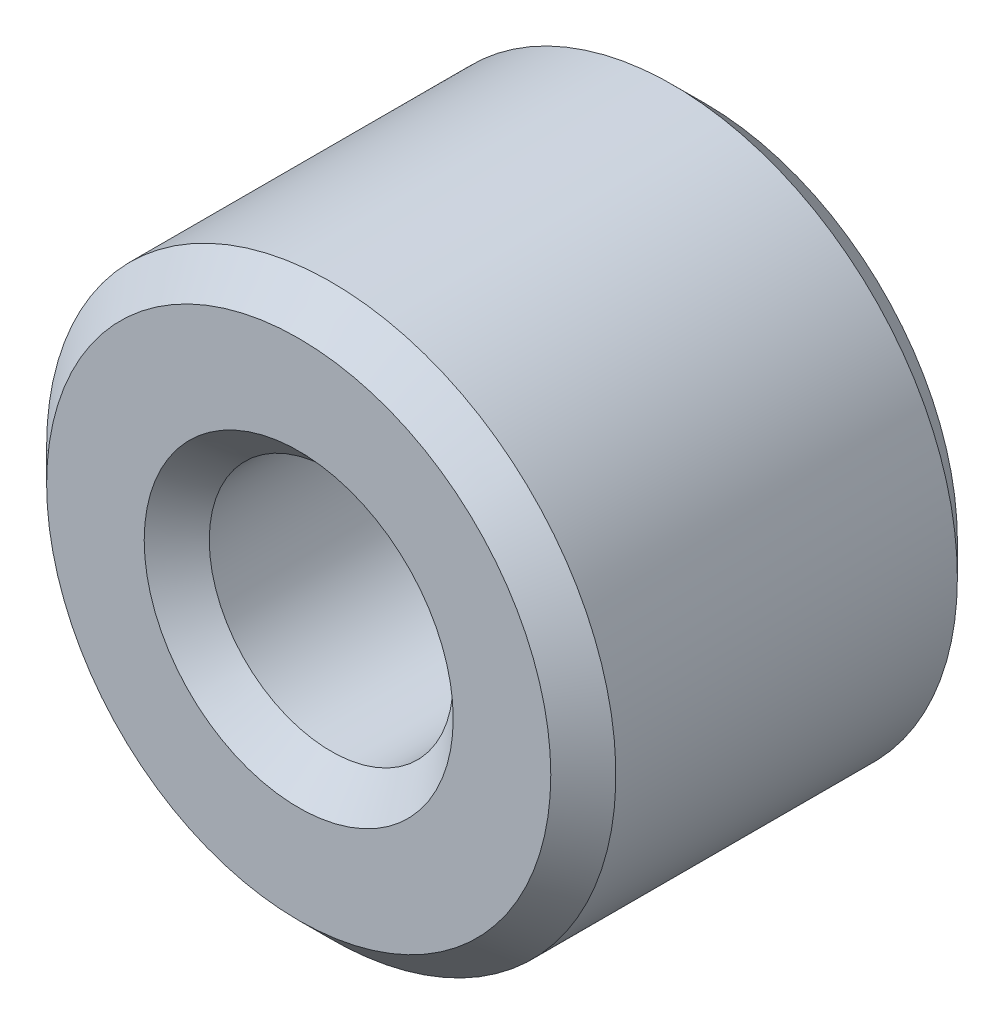
ISO-10303-21;
HEADER;
FILE_DESCRIPTION(('STEP AP214'),'2;1');
FILE_NAME('part.step','',(''),(''),'','','');
FILE_SCHEMA(('AUTOMOTIVE_DESIGN { 1 0 10303 214 1 1 1 1 }'));
ENDSEC;
DATA;
#1=APPLICATION_CONTEXT('core data for automotive mechanical design processes');
#2=APPLICATION_PROTOCOL_DEFINITION('international standard','automotive_design',2000,#1);
#3=PRODUCT_CONTEXT('',#1,'mechanical');
#4=PRODUCT('Part','Part','',(#3));
#5=PRODUCT_RELATED_PRODUCT_CATEGORY('part','',(#4));
#6=PRODUCT_DEFINITION_FORMATION('','',#4);
#7=PRODUCT_DEFINITION_CONTEXT('part definition',#1,'design');
#8=PRODUCT_DEFINITION('design','',#6,#7);
#9=PRODUCT_DEFINITION_SHAPE('','',#8);
#10=(LENGTH_UNIT() NAMED_UNIT(*) SI_UNIT(.MILLI.,.METRE.));
#11=(NAMED_UNIT(*) PLANE_ANGLE_UNIT() SI_UNIT($,.RADIAN.));
#12=(NAMED_UNIT(*) SI_UNIT($,.STERADIAN.) SOLID_ANGLE_UNIT());
#13=UNCERTAINTY_MEASURE_WITH_UNIT(LENGTH_MEASURE(1.E-05),#10,'distance_accuracy_value','');
#14=(GEOMETRIC_REPRESENTATION_CONTEXT(3) GLOBAL_UNCERTAINTY_ASSIGNED_CONTEXT((#13)) GLOBAL_UNIT_ASSIGNED_CONTEXT((#10,
#11,#12)) REPRESENTATION_CONTEXT('',''));
#15=CARTESIAN_POINT('',(0.,0.,0.));
#16=DIRECTION('',(0.,0.,1.));
#17=DIRECTION('',(1.,0.,0.));
#18=AXIS2_PLACEMENT_3D('',#15,#16,#17);
#19=CARTESIAN_POINT('',(0.,0.,5.));
#20=DIRECTION('',(0.,0.,1.));
#21=DIRECTION('',(1.,0.,0.));
#22=AXIS2_PLACEMENT_3D('',#19,#20,#21);
#23=PLANE('',#22);
#24=CARTESIAN_POINT('',(0.,0.,5.));
#25=DIRECTION('',(0.,0.,1.));
#26=DIRECTION('',(1.,0.,0.));
#27=AXIS2_PLACEMENT_3D('',#24,#25,#26);
#28=CIRCLE('',#27,1.9);
#29=CARTESIAN_POINT('',(1.9,0.,5.));
#30=VERTEX_POINT('',#29);
#31=EDGE_CURVE('E10',#30,#30,#28,.F.);
#32=ORIENTED_EDGE('',*,*,#31,.T.);
#33=EDGE_LOOP('',(#32));
#34=FACE_BOUND('',#33,.T.);
#35=CARTESIAN_POINT('',(0.,0.,5.));
#36=DIRECTION('',(0.,0.,1.));
#37=DIRECTION('',(1.,0.,0.));
#38=AXIS2_PLACEMENT_3D('',#35,#36,#37);
#39=CIRCLE('',#38,3.1);
#40=CARTESIAN_POINT('',(-3.1,0.,5.));
#41=VERTEX_POINT('',#40);
#42=EDGE_CURVE('E43',#41,#41,#39,.T.);
#43=ORIENTED_EDGE('',*,*,#42,.T.);
#44=EDGE_LOOP('',(#43));
#45=FACE_BOUND('',#44,.T.);
#46=ADVANCED_FACE('F35',(#34,#45),#23,.T.);
#47=CARTESIAN_POINT('',(0.,0.,0.));
#48=DIRECTION('',(0.,0.,1.));
#49=DIRECTION('',(1.,0.,0.));
#50=AXIS2_PLACEMENT_3D('',#47,#48,#49);
#51=PLANE('',#50);
#52=CARTESIAN_POINT('',(0.,0.,0.));
#53=DIRECTION('',(0.,0.,1.));
#54=DIRECTION('',(1.,0.,0.));
#55=AXIS2_PLACEMENT_3D('',#52,#53,#54);
#56=CIRCLE('',#55,1.9);
#57=CARTESIAN_POINT('',(1.9,0.,0.));
#58=VERTEX_POINT('',#57);
#59=EDGE_CURVE('E62',#58,#58,#56,.T.);
#60=ORIENTED_EDGE('',*,*,#59,.T.);
#61=EDGE_LOOP('',(#60));
#62=FACE_BOUND('',#61,.T.);
#63=CARTESIAN_POINT('',(0.,0.,0.));
#64=DIRECTION('',(0.,0.,1.));
#65=DIRECTION('',(1.,0.,0.));
#66=AXIS2_PLACEMENT_3D('',#63,#64,#65);
#67=CIRCLE('',#66,3.1);
#68=CARTESIAN_POINT('',(3.1,0.,0.));
#69=VERTEX_POINT('',#68);
#70=EDGE_CURVE('E65',#69,#69,#67,.F.);
#71=ORIENTED_EDGE('',*,*,#70,.T.);
#72=EDGE_LOOP('',(#71));
#73=FACE_BOUND('',#72,.T.);
#74=ADVANCED_FACE('F69',(#62,#73),#51,.F.);
#75=CARTESIAN_POINT('',(0.,0.,5.));
#76=DIRECTION('',(0.,0.,-1.));
#77=DIRECTION('',(-1.,0.,0.));
#78=AXIS2_PLACEMENT_3D('',#75,#76,#77);
#79=CYLINDRICAL_SURFACE('',#78,3.5);
#80=CARTESIAN_POINT('',(0.,0.,0.400000000000002));
#81=DIRECTION('',(0.,0.,1.));
#82=DIRECTION('',(1.,0.,0.));
#83=AXIS2_PLACEMENT_3D('',#80,#81,#82);
#84=CIRCLE('',#83,3.5);
#85=CARTESIAN_POINT('',(3.5,0.,0.400000000000002));
#86=VERTEX_POINT('',#85);
#87=EDGE_CURVE('E47',#86,#86,#84,.T.);
#88=ORIENTED_EDGE('',*,*,#87,.T.);
#89=EDGE_LOOP('',(#88));
#90=FACE_BOUND('',#89,.T.);
#91=CARTESIAN_POINT('',(0.,0.,4.6));
#92=DIRECTION('',(0.,0.,1.));
#93=DIRECTION('',(1.,0.,0.));
#94=AXIS2_PLACEMENT_3D('',#91,#92,#93);
#95=CIRCLE('',#94,3.5);
#96=CARTESIAN_POINT('',(-3.5,0.,4.6));
#97=VERTEX_POINT('',#96);
#98=EDGE_CURVE('E51',#97,#97,#95,.F.);
#99=ORIENTED_EDGE('',*,*,#98,.T.);
#100=EDGE_LOOP('',(#99));
#101=FACE_BOUND('',#100,.T.);
#102=ADVANCED_FACE('F79',(#90,#101),#79,.T.);
#103=CARTESIAN_POINT('',(0.,0.,5.));
#104=DIRECTION('',(0.,0.,-1.));
#105=DIRECTION('',(-1.,0.,0.));
#106=AXIS2_PLACEMENT_3D('',#103,#104,#105);
#107=CYLINDRICAL_SURFACE('',#106,1.5);
#108=CARTESIAN_POINT('',(0.,0.,0.400000000000002));
#109=DIRECTION('',(0.,0.,1.));
#110=DIRECTION('',(1.,0.,0.));
#111=AXIS2_PLACEMENT_3D('',#108,#109,#110);
#112=CIRCLE('',#111,1.5);
#113=CARTESIAN_POINT('',(1.5,0.,0.400000000000002));
#114=VERTEX_POINT('',#113);
#115=EDGE_CURVE('E56',#114,#114,#112,.F.);
#116=ORIENTED_EDGE('',*,*,#115,.T.);
#117=EDGE_LOOP('',(#116));
#118=FACE_BOUND('',#117,.T.);
#119=CARTESIAN_POINT('',(0.,0.,4.6));
#120=DIRECTION('',(0.,0.,1.));
#121=DIRECTION('',(1.,0.,0.));
#122=AXIS2_PLACEMENT_3D('',#119,#120,#121);
#123=CIRCLE('',#122,1.5);
#124=CARTESIAN_POINT('',(1.5,0.,4.6));
#125=VERTEX_POINT('',#124);
#126=EDGE_CURVE('E59',#125,#125,#123,.T.);
#127=ORIENTED_EDGE('',*,*,#126,.T.);
#128=EDGE_LOOP('',(#127));
#129=FACE_BOUND('',#128,.T.);
#130=ADVANCED_FACE('F82',(#118,#129),#107,.F.);
#131=CARTESIAN_POINT('',(0.,0.,0.));
#132=DIRECTION('',(0.,0.,-1.));
#133=DIRECTION('',(-1.,0.,0.));
#134=AXIS2_PLACEMENT_3D('',#131,#132,#133);
#135=CONICAL_SURFACE('',#134,1.9,0.785398163397445);
#136=ORIENTED_EDGE('',*,*,#115,.F.);
#137=EDGE_LOOP('',(#136));
#138=FACE_BOUND('',#137,.T.);
#139=ORIENTED_EDGE('',*,*,#59,.F.);
#140=EDGE_LOOP('',(#139));
#141=FACE_BOUND('',#140,.T.);
#142=ADVANCED_FACE('F75',(#138,#141),#135,.F.);
#143=CARTESIAN_POINT('',(0.,0.,0.400000000000002));
#144=DIRECTION('',(0.,0.,1.));
#145=DIRECTION('',(1.,0.,0.));
#146=AXIS2_PLACEMENT_3D('',#143,#144,#145);
#147=CONICAL_SURFACE('',#146,3.5,0.785398163397452);
#148=ORIENTED_EDGE('',*,*,#70,.F.);
#149=EDGE_LOOP('',(#148));
#150=FACE_BOUND('',#149,.T.);
#151=ORIENTED_EDGE('',*,*,#87,.F.);
#152=EDGE_LOOP('',(#151));
#153=FACE_BOUND('',#152,.T.);
#154=ADVANCED_FACE('F71',(#150,#153),#147,.T.);
#155=CARTESIAN_POINT('',(0.,0.,4.6));
#156=DIRECTION('',(0.,0.,1.));
#157=DIRECTION('',(1.,0.,0.));
#158=AXIS2_PLACEMENT_3D('',#155,#156,#157);
#159=CONICAL_SURFACE('',#158,1.5,0.785398163397451);
#160=ORIENTED_EDGE('',*,*,#31,.F.);
#161=EDGE_LOOP('',(#160));
#162=FACE_BOUND('',#161,.T.);
#163=ORIENTED_EDGE('',*,*,#126,.F.);
#164=EDGE_LOOP('',(#163));
#165=FACE_BOUND('',#164,.T.);
#166=ADVANCED_FACE('F74',(#162,#165),#159,.F.);
#167=CARTESIAN_POINT('',(0.,0.,5.));
#168=DIRECTION('',(0.,0.,-1.));
#169=DIRECTION('',(-1.,0.,0.));
#170=AXIS2_PLACEMENT_3D('',#167,#168,#169);
#171=CONICAL_SURFACE('',#170,3.1,0.785398163397446);
#172=CARTESIAN_POINT('',(-3.5,0.,4.6));
#173=CARTESIAN_POINT('',(-3.49583333333333,0.,4.60416666666667));
#174=CARTESIAN_POINT('',(-3.49166666666667,0.,4.60833333333334));
#175=CARTESIAN_POINT('',(-3.48333333333333,0.,4.61666666666667));
#176=CARTESIAN_POINT('',(-3.47916666666667,0.,4.62083333333333));
#177=CARTESIAN_POINT('',(-3.47083333333333,0.,4.62916666666667));
#178=CARTESIAN_POINT('',(-3.46666666666667,0.,4.63333333333333));
#179=CARTESIAN_POINT('',(-3.45833333333333,0.,4.64166666666667));
#180=CARTESIAN_POINT('',(-3.45416666666667,0.,4.64583333333333));
#181=CARTESIAN_POINT('',(-3.44583333333333,0.,4.65416666666667));
#182=CARTESIAN_POINT('',(-3.44166666666667,0.,4.65833333333333));
#183=CARTESIAN_POINT('',(-3.43333333333333,0.,4.66666666666667));
#184=CARTESIAN_POINT('',(-3.42916666666667,0.,4.67083333333333));
#185=CARTESIAN_POINT('',(-3.42083333333333,0.,4.67916666666667));
#186=CARTESIAN_POINT('',(-3.41666666666667,0.,4.68333333333333));
#187=CARTESIAN_POINT('',(-3.40833333333333,0.,4.69166666666667));
#188=CARTESIAN_POINT('',(-3.40416666666667,0.,4.69583333333333));
#189=CARTESIAN_POINT('',(-3.39583333333333,0.,4.70416666666667));
#190=CARTESIAN_POINT('',(-3.39166666666667,0.,4.70833333333333));
#191=CARTESIAN_POINT('',(-3.38333333333334,0.,4.71666666666667));
#192=CARTESIAN_POINT('',(-3.37916666666667,0.,4.72083333333333));
#193=CARTESIAN_POINT('',(-3.37083333333333,0.,4.72916666666667));
#194=CARTESIAN_POINT('',(-3.36666666666667,0.,4.73333333333333));
#195=CARTESIAN_POINT('',(-3.35833333333334,0.,4.74166666666667));
#196=CARTESIAN_POINT('',(-3.35416666666667,0.,4.74583333333333));
#197=CARTESIAN_POINT('',(-3.34583333333333,0.,4.75416666666667));
#198=CARTESIAN_POINT('',(-3.34166666666667,0.,4.75833333333333));
#199=CARTESIAN_POINT('',(-3.33333333333334,0.,4.76666666666667));
#200=CARTESIAN_POINT('',(-3.32916666666667,0.,4.77083333333333));
#201=CARTESIAN_POINT('',(-3.32083333333334,0.,4.77916666666667));
#202=CARTESIAN_POINT('',(-3.31666666666667,0.,4.78333333333333));
#203=CARTESIAN_POINT('',(-3.30833333333334,0.,4.79166666666667));
#204=CARTESIAN_POINT('',(-3.30416666666667,0.,4.79583333333333));
#205=CARTESIAN_POINT('',(-3.29583333333334,0.,4.80416666666667));
#206=CARTESIAN_POINT('',(-3.29166666666667,0.,4.80833333333333));
#207=CARTESIAN_POINT('',(-3.28333333333334,0.,4.81666666666667));
#208=CARTESIAN_POINT('',(-3.27916666666667,0.,4.82083333333333));
#209=CARTESIAN_POINT('',(-3.27083333333334,0.,4.82916666666667));
#210=CARTESIAN_POINT('',(-3.26666666666667,0.,4.83333333333333));
#211=CARTESIAN_POINT('',(-3.25833333333334,0.,4.84166666666667));
#212=CARTESIAN_POINT('',(-3.25416666666667,0.,4.84583333333333));
#213=CARTESIAN_POINT('',(-3.24583333333334,0.,4.85416666666667));
#214=CARTESIAN_POINT('',(-3.24166666666667,0.,4.85833333333333));
#215=CARTESIAN_POINT('',(-3.23333333333334,0.,4.86666666666667));
#216=CARTESIAN_POINT('',(-3.22916666666667,0.,4.87083333333333));
#217=CARTESIAN_POINT('',(-3.22083333333334,0.,4.87916666666667));
#218=CARTESIAN_POINT('',(-3.21666666666667,0.,4.88333333333333));
#219=CARTESIAN_POINT('',(-3.20833333333334,0.,4.89166666666667));
#220=CARTESIAN_POINT('',(-3.20416666666667,0.,4.89583333333333));
#221=CARTESIAN_POINT('',(-3.19583333333334,0.,4.90416666666667));
#222=CARTESIAN_POINT('',(-3.19166666666667,0.,4.90833333333333));
#223=CARTESIAN_POINT('',(-3.18333333333334,0.,4.91666666666667));
#224=CARTESIAN_POINT('',(-3.17916666666667,0.,4.92083333333333));
#225=CARTESIAN_POINT('',(-3.17083333333334,0.,4.92916666666667));
#226=CARTESIAN_POINT('',(-3.16666666666667,0.,4.93333333333333));
#227=CARTESIAN_POINT('',(-3.15833333333334,0.,4.94166666666667));
#228=CARTESIAN_POINT('',(-3.15416666666667,0.,4.94583333333333));
#229=CARTESIAN_POINT('',(-3.14583333333334,0.,4.95416666666667));
#230=CARTESIAN_POINT('',(-3.14166666666667,0.,4.95833333333333));
#231=CARTESIAN_POINT('',(-3.13333333333334,0.,4.96666666666667));
#232=CARTESIAN_POINT('',(-3.12916666666667,0.,4.97083333333333));
#233=CARTESIAN_POINT('',(-3.12083333333334,0.,4.97916666666667));
#234=CARTESIAN_POINT('',(-3.11666666666667,0.,4.98333333333333));
#235=CARTESIAN_POINT('',(-3.10833333333334,0.,4.99166666666667));
#236=CARTESIAN_POINT('',(-3.10416666666667,0.,4.99583333333333));
#237=CARTESIAN_POINT('',(-3.1,0.,5.));
#238=B_SPLINE_CURVE_WITH_KNOTS('',3,(#172,#173,#174,#175,#176,#177,#178,#179,#180,#181,#182,
#183,#184,#185,#186,#187,#188,#189,#190,#191,#192,#193,#194,#195,#196,#197,#198,#199,#200,#201,
#202,#203,#204,#205,#206,#207,#208,#209,#210,#211,#212,#213,#214,#215,#216,#217,#218,#219,#220,
#221,#222,#223,#224,#225,#226,#227,#228,#229,#230,#231,#232,#233,#234,#235,#236,#237),
.UNSPECIFIED.,.F.,.F.,(4,2,2,2,2,2,2,2,2,2,2,2,2,2,2,2,2,2,2,2,2,2,2,2,2,2,2,2,2,2,2,2,4),(0.,
0.0176776695296639,0.0353553390593272,0.0530330085889907,0.0707106781186546,0.0883883476483179,
0.106066017177982,0.123743686707645,0.141421356237309,0.159099025766972,0.176776695296636,
0.194454364826299,0.212132034355963,0.229809703885627,0.24748737341529,0.265165042944953,
0.282842712474617,0.300520382004281,0.318198051533944,0.335875721063608,0.353553390593272,
0.371231060122935,0.388908729652599,0.406586399182263,0.424264068711926,0.44194173824159,
0.459619407771253,0.477297077300917,0.49497474683058,0.512652416360244,0.530330085889907,
0.548007755419571,0.565685424949235),.UNSPECIFIED.);
#239=EDGE_CURVE('BSEAM38',#97,#41,#238,.T.);
#240=ORIENTED_EDGE('',*,*,#98,.F.);
#241=ORIENTED_EDGE('',*,*,#42,.F.);
#242=ORIENTED_EDGE('',*,*,#239,.T.);
#243=ORIENTED_EDGE('',*,*,#239,.F.);
#244=EDGE_LOOP('',(#240,#242,#241,#243));
#245=FACE_BOUND('',#244,.T.);
#246=ADVANCED_FACE('F38',(#245),#171,.T.);
#247=CLOSED_SHELL('',(#46,#74,#102,#130,#142,#154,#166,#246));
#248=MANIFOLD_SOLID_BREP('B2',#247);
#249=ADVANCED_BREP_SHAPE_REPRESENTATION('',(#18,#248),#14);
#250=SHAPE_DEFINITION_REPRESENTATION(#9,#249);
ENDSEC;
END-ISO-10303-21;
